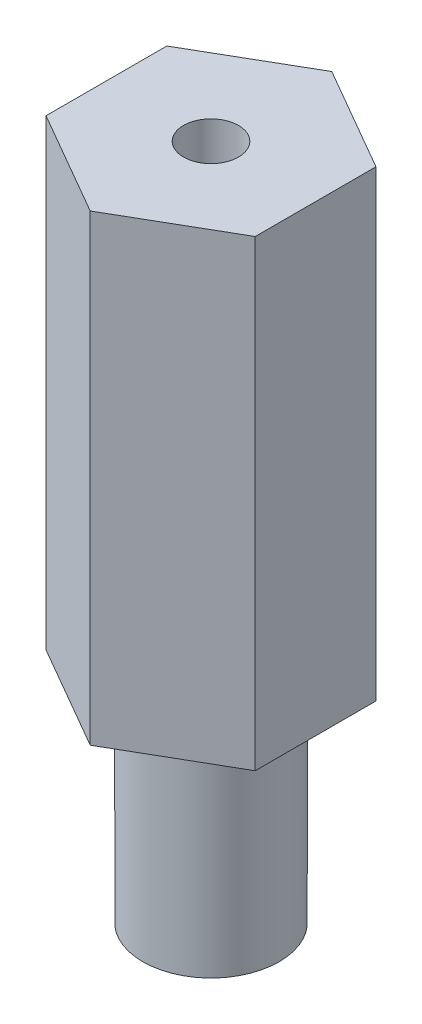
ISO-10303-21;
HEADER;
FILE_DESCRIPTION(('STEP AP214'),'2;1');
FILE_NAME('part.step','',(''),(''),'','','');
FILE_SCHEMA(('AUTOMOTIVE_DESIGN { 1 0 10303 214 1 1 1 1 }'));
ENDSEC;
DATA;
#1=APPLICATION_CONTEXT('core data for automotive mechanical design processes');
#2=APPLICATION_PROTOCOL_DEFINITION('international standard','automotive_design',2000,#1);
#3=PRODUCT_CONTEXT('',#1,'mechanical');
#4=PRODUCT('Part','Part','',(#3));
#5=PRODUCT_RELATED_PRODUCT_CATEGORY('part','',(#4));
#6=PRODUCT_DEFINITION_FORMATION('','',#4);
#7=PRODUCT_DEFINITION_CONTEXT('part definition',#1,'design');
#8=PRODUCT_DEFINITION('design','',#6,#7);
#9=PRODUCT_DEFINITION_SHAPE('','',#8);
#10=(LENGTH_UNIT() NAMED_UNIT(*) SI_UNIT(.MILLI.,.METRE.));
#11=(NAMED_UNIT(*) PLANE_ANGLE_UNIT() SI_UNIT($,.RADIAN.));
#12=(NAMED_UNIT(*) SI_UNIT($,.STERADIAN.) SOLID_ANGLE_UNIT());
#13=UNCERTAINTY_MEASURE_WITH_UNIT(LENGTH_MEASURE(1.E-05),#10,'distance_accuracy_value','');
#14=(GEOMETRIC_REPRESENTATION_CONTEXT(3) GLOBAL_UNCERTAINTY_ASSIGNED_CONTEXT((#13)) GLOBAL_UNIT_ASSIGNED_CONTEXT((#10,
#11,#12)) REPRESENTATION_CONTEXT('',''));
#15=CARTESIAN_POINT('',(0.,0.,0.));
#16=DIRECTION('',(0.,0.,1.));
#17=DIRECTION('',(1.,0.,0.));
#18=AXIS2_PLACEMENT_3D('',#15,#16,#17);
#19=CARTESIAN_POINT('',(2.2606,0.,-1.30515801853007));
#20=DIRECTION('',(0.,1.,0.));
#21=DIRECTION('',(0.,0.,1.));
#22=AXIS2_PLACEMENT_3D('',#19,#20,#21);
#23=PLANE('',#22);
#24=DIRECTION('',(0.,0.,-1.));
#25=VECTOR('',#24,1.);
#26=CARTESIAN_POINT('',(2.2606,0.,1.30515801853007));
#27=LINE('',#26,#25);
#28=CARTESIAN_POINT('',(2.2606,0.,1.30515801853007));
#29=VERTEX_POINT('',#28);
#30=CARTESIAN_POINT('',(2.2606,0.,-1.30515801853007));
#31=VERTEX_POINT('',#30);
#32=EDGE_CURVE('E119',#29,#31,#27,.T.);
#33=ORIENTED_EDGE('',*,*,#32,.F.);
#34=DIRECTION('',(0.866025403784438,0.,-0.5));
#35=VECTOR('',#34,1.);
#36=CARTESIAN_POINT('',(0.,0.,2.61031603706014));
#37=LINE('',#36,#35);
#38=CARTESIAN_POINT('',(0.,0.,2.61031603706014));
#39=VERTEX_POINT('',#38);
#40=EDGE_CURVE('E79',#39,#29,#37,.T.);
#41=ORIENTED_EDGE('',*,*,#40,.F.);
#42=DIRECTION('',(0.866025403784439,0.,0.5));
#43=VECTOR('',#42,1.);
#44=CARTESIAN_POINT('',(-2.2606,0.,1.30515801853007));
#45=LINE('',#44,#43);
#46=CARTESIAN_POINT('',(-2.2606,0.,1.30515801853007));
#47=VERTEX_POINT('',#46);
#48=EDGE_CURVE('E73',#47,#39,#45,.T.);
#49=ORIENTED_EDGE('',*,*,#48,.F.);
#50=DIRECTION('',(0.,0.,1.));
#51=VECTOR('',#50,1.);
#52=CARTESIAN_POINT('',(-2.2606,0.,-1.30515801853007));
#53=LINE('',#52,#51);
#54=CARTESIAN_POINT('',(-2.2606,0.,-1.30515801853007));
#55=VERTEX_POINT('',#54);
#56=EDGE_CURVE('E109',#55,#47,#53,.T.);
#57=ORIENTED_EDGE('',*,*,#56,.F.);
#58=DIRECTION('',(-0.866025403784439,0.,0.5));
#59=VECTOR('',#58,1.);
#60=CARTESIAN_POINT('',(0.,0.,-2.61031603706014));
#61=LINE('',#60,#59);
#62=CARTESIAN_POINT('',(0.,0.,-2.61031603706014));
#63=VERTEX_POINT('',#62);
#64=EDGE_CURVE('E125',#63,#55,#61,.T.);
#65=ORIENTED_EDGE('',*,*,#64,.F.);
#66=DIRECTION('',(-0.866025403784439,0.,-0.5));
#67=VECTOR('',#66,1.);
#68=CARTESIAN_POINT('',(2.2606,0.,-1.30515801853007));
#69=LINE('',#68,#67);
#70=EDGE_CURVE('E122',#31,#63,#69,.T.);
#71=ORIENTED_EDGE('',*,*,#70,.F.);
#72=EDGE_LOOP('',(#33,#41,#49,#57,#65,#71));
#73=FACE_BOUND('',#72,.T.);
#74=CARTESIAN_POINT('',(0.,0.,0.));
#75=DIRECTION('',(0.,1.,0.));
#76=DIRECTION('',(0.,0.,1.));
#77=AXIS2_PLACEMENT_3D('',#74,#75,#76);
#78=CIRCLE('',#77,1.4732);
#79=CARTESIAN_POINT('',(0.,0.,1.4732));
#80=VERTEX_POINT('',#79);
#81=EDGE_CURVE('E11',#80,#80,#78,.F.);
#82=ORIENTED_EDGE('',*,*,#81,.F.);
#83=EDGE_LOOP('',(#82));
#84=FACE_BOUND('',#83,.T.);
#85=ADVANCED_FACE('F33',(#73,#84),#23,.F.);
#86=CARTESIAN_POINT('',(2.2606,10.,1.30515801853007));
#87=DIRECTION('',(-1.,0.,0.));
#88=DIRECTION('',(0.,0.,1.));
#89=AXIS2_PLACEMENT_3D('',#86,#87,#88);
#90=PLANE('',#89);
#91=ORIENTED_EDGE('',*,*,#32,.T.);
#92=DIRECTION('',(0.,-1.,0.));
#93=VECTOR('',#92,1.);
#94=CARTESIAN_POINT('',(2.2606,10.,-1.30515801853007));
#95=LINE('',#94,#93);
#96=CARTESIAN_POINT('',(2.2606,10.,-1.30515801853007));
#97=VERTEX_POINT('',#96);
#98=EDGE_CURVE('E42',#97,#31,#95,.T.);
#99=ORIENTED_EDGE('',*,*,#98,.F.);
#100=DIRECTION('',(0.,0.,-1.));
#101=VECTOR('',#100,1.);
#102=CARTESIAN_POINT('',(2.2606,10.,1.30515801853007));
#103=LINE('',#102,#101);
#104=CARTESIAN_POINT('',(2.2606,10.,1.30515801853007));
#105=VERTEX_POINT('',#104);
#106=EDGE_CURVE('E130',#105,#97,#103,.T.);
#107=ORIENTED_EDGE('',*,*,#106,.F.);
#108=DIRECTION('',(0.,-1.,0.));
#109=VECTOR('',#108,1.);
#110=CARTESIAN_POINT('',(2.2606,10.,1.30515801853007));
#111=LINE('',#110,#109);
#112=EDGE_CURVE('E115',#105,#29,#111,.T.);
#113=ORIENTED_EDGE('',*,*,#112,.T.);
#114=EDGE_LOOP('',(#91,#99,#107,#113));
#115=FACE_BOUND('',#114,.T.);
#116=ADVANCED_FACE('F35',(#115),#90,.F.);
#117=CARTESIAN_POINT('',(2.2606,10.,-1.30515801853007));
#118=DIRECTION('',(-0.5,0.,0.866025403784438));
#119=DIRECTION('',(0.866025403784439,0.,0.5));
#120=AXIS2_PLACEMENT_3D('',#117,#118,#119);
#121=PLANE('',#120);
#122=ORIENTED_EDGE('',*,*,#70,.T.);
#123=DIRECTION('',(0.,-1.,0.));
#124=VECTOR('',#123,1.);
#125=CARTESIAN_POINT('',(0.,10.,-2.61031603706014));
#126=LINE('',#125,#124);
#127=CARTESIAN_POINT('',(0.,10.,-2.61031603706014));
#128=VERTEX_POINT('',#127);
#129=EDGE_CURVE('E134',#128,#63,#126,.T.);
#130=ORIENTED_EDGE('',*,*,#129,.F.);
#131=DIRECTION('',(-0.866025403784439,0.,-0.5));
#132=VECTOR('',#131,1.);
#133=CARTESIAN_POINT('',(2.2606,10.,-1.30515801853007));
#134=LINE('',#133,#132);
#135=EDGE_CURVE('E88',#97,#128,#134,.T.);
#136=ORIENTED_EDGE('',*,*,#135,.F.);
#137=ORIENTED_EDGE('',*,*,#98,.T.);
#138=EDGE_LOOP('',(#122,#130,#136,#137));
#139=FACE_BOUND('',#138,.T.);
#140=ADVANCED_FACE('F137',(#139),#121,.F.);
#141=CARTESIAN_POINT('',(0.,10.,-2.61031603706014));
#142=DIRECTION('',(0.5,0.,0.866025403784438));
#143=DIRECTION('',(0.866025403784439,0.,-0.5));
#144=AXIS2_PLACEMENT_3D('',#141,#142,#143);
#145=PLANE('',#144);
#146=ORIENTED_EDGE('',*,*,#64,.T.);
#147=DIRECTION('',(0.,-1.,0.));
#148=VECTOR('',#147,1.);
#149=CARTESIAN_POINT('',(-2.2606,10.,-1.30515801853007));
#150=LINE('',#149,#148);
#151=CARTESIAN_POINT('',(-2.2606,10.,-1.30515801853007));
#152=VERTEX_POINT('',#151);
#153=EDGE_CURVE('E110',#152,#55,#150,.T.);
#154=ORIENTED_EDGE('',*,*,#153,.F.);
#155=DIRECTION('',(-0.866025403784439,0.,0.5));
#156=VECTOR('',#155,1.);
#157=CARTESIAN_POINT('',(0.,10.,-2.61031603706014));
#158=LINE('',#157,#156);
#159=EDGE_CURVE('E101',#128,#152,#158,.T.);
#160=ORIENTED_EDGE('',*,*,#159,.F.);
#161=ORIENTED_EDGE('',*,*,#129,.T.);
#162=EDGE_LOOP('',(#146,#154,#160,#161));
#163=FACE_BOUND('',#162,.T.);
#164=ADVANCED_FACE('F145',(#163),#145,.F.);
#165=CARTESIAN_POINT('',(-2.2606,10.,-1.30515801853007));
#166=DIRECTION('',(1.,0.,0.));
#167=DIRECTION('',(0.,0.,-1.));
#168=AXIS2_PLACEMENT_3D('',#165,#166,#167);
#169=PLANE('',#168);
#170=ORIENTED_EDGE('',*,*,#56,.T.);
#171=DIRECTION('',(0.,-1.,0.));
#172=VECTOR('',#171,1.);
#173=CARTESIAN_POINT('',(-2.2606,10.,1.30515801853007));
#174=LINE('',#173,#172);
#175=CARTESIAN_POINT('',(-2.2606,10.,1.30515801853007));
#176=VERTEX_POINT('',#175);
#177=EDGE_CURVE('E106',#176,#47,#174,.T.);
#178=ORIENTED_EDGE('',*,*,#177,.F.);
#179=DIRECTION('',(0.,0.,1.));
#180=VECTOR('',#179,1.);
#181=CARTESIAN_POINT('',(-2.2606,10.,-1.30515801853007));
#182=LINE('',#181,#180);
#183=EDGE_CURVE('E95',#152,#176,#182,.T.);
#184=ORIENTED_EDGE('',*,*,#183,.F.);
#185=ORIENTED_EDGE('',*,*,#153,.T.);
#186=EDGE_LOOP('',(#170,#178,#184,#185));
#187=FACE_BOUND('',#186,.T.);
#188=ADVANCED_FACE('F107',(#187),#169,.F.);
#189=CARTESIAN_POINT('',(-2.2606,10.,1.30515801853007));
#190=DIRECTION('',(0.5,0.,-0.866025403784438));
#191=DIRECTION('',(-0.866025403784439,0.,-0.5));
#192=AXIS2_PLACEMENT_3D('',#189,#190,#191);
#193=PLANE('',#192);
#194=ORIENTED_EDGE('',*,*,#48,.T.);
#195=DIRECTION('',(0.,-1.,0.));
#196=VECTOR('',#195,1.);
#197=CARTESIAN_POINT('',(0.,10.,2.61031603706014));
#198=LINE('',#197,#196);
#199=CARTESIAN_POINT('',(0.,10.,2.61031603706014));
#200=VERTEX_POINT('',#199);
#201=EDGE_CURVE('E111',#200,#39,#198,.T.);
#202=ORIENTED_EDGE('',*,*,#201,.F.);
#203=DIRECTION('',(0.866025403784439,0.,0.5));
#204=VECTOR('',#203,1.);
#205=CARTESIAN_POINT('',(-2.2606,10.,1.30515801853007));
#206=LINE('',#205,#204);
#207=EDGE_CURVE('E99',#176,#200,#206,.T.);
#208=ORIENTED_EDGE('',*,*,#207,.F.);
#209=ORIENTED_EDGE('',*,*,#177,.T.);
#210=EDGE_LOOP('',(#194,#202,#208,#209));
#211=FACE_BOUND('',#210,.T.);
#212=ADVANCED_FACE('F113',(#211),#193,.F.);
#213=CARTESIAN_POINT('',(0.,10.,2.61031603706014));
#214=DIRECTION('',(-0.5,0.,-0.866025403784438));
#215=DIRECTION('',(-0.866025403784439,0.,0.5));
#216=AXIS2_PLACEMENT_3D('',#213,#214,#215);
#217=PLANE('',#216);
#218=ORIENTED_EDGE('',*,*,#40,.T.);
#219=ORIENTED_EDGE('',*,*,#112,.F.);
#220=DIRECTION('',(0.866025403784438,0.,-0.5));
#221=VECTOR('',#220,1.);
#222=CARTESIAN_POINT('',(0.,10.,2.61031603706014));
#223=LINE('',#222,#221);
#224=EDGE_CURVE('E50',#200,#105,#223,.T.);
#225=ORIENTED_EDGE('',*,*,#224,.F.);
#226=ORIENTED_EDGE('',*,*,#201,.T.);
#227=EDGE_LOOP('',(#218,#219,#225,#226));
#228=FACE_BOUND('',#227,.T.);
#229=ADVANCED_FACE('F169',(#228),#217,.F.);
#230=CARTESIAN_POINT('',(2.2606,10.,-1.30515801853007));
#231=DIRECTION('',(0.,1.,0.));
#232=DIRECTION('',(0.,0.,1.));
#233=AXIS2_PLACEMENT_3D('',#230,#231,#232);
#234=PLANE('',#233);
#235=CARTESIAN_POINT('',(0.,10.,0.));
#236=DIRECTION('',(0.,1.,0.));
#237=DIRECTION('',(0.,0.,1.));
#238=AXIS2_PLACEMENT_3D('',#235,#236,#237);
#239=CIRCLE('',#238,0.593671867306966);
#240=CARTESIAN_POINT('',(0.,10.,0.593671867306966));
#241=VERTEX_POINT('',#240);
#242=EDGE_CURVE('E152',#241,#241,#239,.T.);
#243=ORIENTED_EDGE('',*,*,#242,.F.);
#244=EDGE_LOOP('',(#243));
#245=FACE_BOUND('',#244,.T.);
#246=ORIENTED_EDGE('',*,*,#106,.T.);
#247=ORIENTED_EDGE('',*,*,#135,.T.);
#248=ORIENTED_EDGE('',*,*,#159,.T.);
#249=ORIENTED_EDGE('',*,*,#183,.T.);
#250=ORIENTED_EDGE('',*,*,#207,.T.);
#251=ORIENTED_EDGE('',*,*,#224,.T.);
#252=EDGE_LOOP('',(#246,#247,#248,#249,#250,#251));
#253=FACE_BOUND('',#252,.T.);
#254=ADVANCED_FACE('F97',(#245,#253),#234,.T.);
#255=CARTESIAN_POINT('',(0.,-4.6228,0.));
#256=DIRECTION('',(0.,1.,0.));
#257=DIRECTION('',(0.,0.,1.));
#258=AXIS2_PLACEMENT_3D('',#255,#256,#257);
#259=CYLINDRICAL_SURFACE('',#258,1.4732);
#260=CARTESIAN_POINT('',(0.,-4.6228,0.));
#261=DIRECTION('',(0.,-1.,0.));
#262=DIRECTION('',(0.,0.,-1.));
#263=AXIS2_PLACEMENT_3D('',#260,#261,#262);
#264=CIRCLE('',#263,1.4732);
#265=CARTESIAN_POINT('',(0.,-4.6228,-1.4732));
#266=VERTEX_POINT('',#265);
#267=EDGE_CURVE('E123',#266,#266,#264,.T.);
#268=ORIENTED_EDGE('',*,*,#267,.F.);
#269=EDGE_LOOP('',(#268));
#270=FACE_BOUND('',#269,.T.);
#271=ORIENTED_EDGE('',*,*,#81,.T.);
#272=EDGE_LOOP('',(#271));
#273=FACE_BOUND('',#272,.T.);
#274=ADVANCED_FACE('F168',(#270,#273),#259,.T.);
#275=CARTESIAN_POINT('',(0.,-4.6228,0.));
#276=DIRECTION('',(0.,-1.,0.));
#277=DIRECTION('',(0.,0.,-1.));
#278=AXIS2_PLACEMENT_3D('',#275,#276,#277);
#279=PLANE('',#278);
#280=ORIENTED_EDGE('',*,*,#267,.T.);
#281=EDGE_LOOP('',(#280));
#282=FACE_BOUND('',#281,.T.);
#283=ADVANCED_FACE('F163',(#282),#279,.T.);
#284=CARTESIAN_POINT('',(0.,7.46,0.));
#285=DIRECTION('',(0.,1.,0.));
#286=DIRECTION('',(0.,0.,1.));
#287=AXIS2_PLACEMENT_3D('',#284,#285,#286);
#288=CYLINDRICAL_SURFACE('',#287,0.593671867306966);
#289=CARTESIAN_POINT('',(0.,7.46,0.));
#290=DIRECTION('',(0.,1.,0.));
#291=DIRECTION('',(0.,0.,1.));
#292=AXIS2_PLACEMENT_3D('',#289,#290,#291);
#293=CIRCLE('',#292,0.593671867306966);
#294=CARTESIAN_POINT('',(0.,7.46,0.593671867306966));
#295=VERTEX_POINT('',#294);
#296=EDGE_CURVE('E151',#295,#295,#293,.T.);
#297=ORIENTED_EDGE('',*,*,#296,.F.);
#298=EDGE_LOOP('',(#297));
#299=FACE_BOUND('',#298,.T.);
#300=ORIENTED_EDGE('',*,*,#242,.T.);
#301=EDGE_LOOP('',(#300));
#302=FACE_BOUND('',#301,.T.);
#303=ADVANCED_FACE('F160',(#299,#302),#288,.F.);
#304=CARTESIAN_POINT('',(0.,7.46,0.));
#305=DIRECTION('',(0.,1.,0.));
#306=DIRECTION('',(0.,0.,1.));
#307=AXIS2_PLACEMENT_3D('',#304,#305,#306);
#308=PLANE('',#307);
#309=ORIENTED_EDGE('',*,*,#296,.T.);
#310=EDGE_LOOP('',(#309));
#311=FACE_BOUND('',#310,.T.);
#312=ADVANCED_FACE('F158',(#311),#308,.T.);
#313=CLOSED_SHELL('',(#85,#116,#140,#164,#188,#212,#229,#254,#274,#283,#303,#312));
#314=MANIFOLD_SOLID_BREP('B2',#313);
#315=ADVANCED_BREP_SHAPE_REPRESENTATION('',(#18,#314),#14);
#316=SHAPE_DEFINITION_REPRESENTATION(#9,#315);
ENDSEC;
END-ISO-10303-21;
